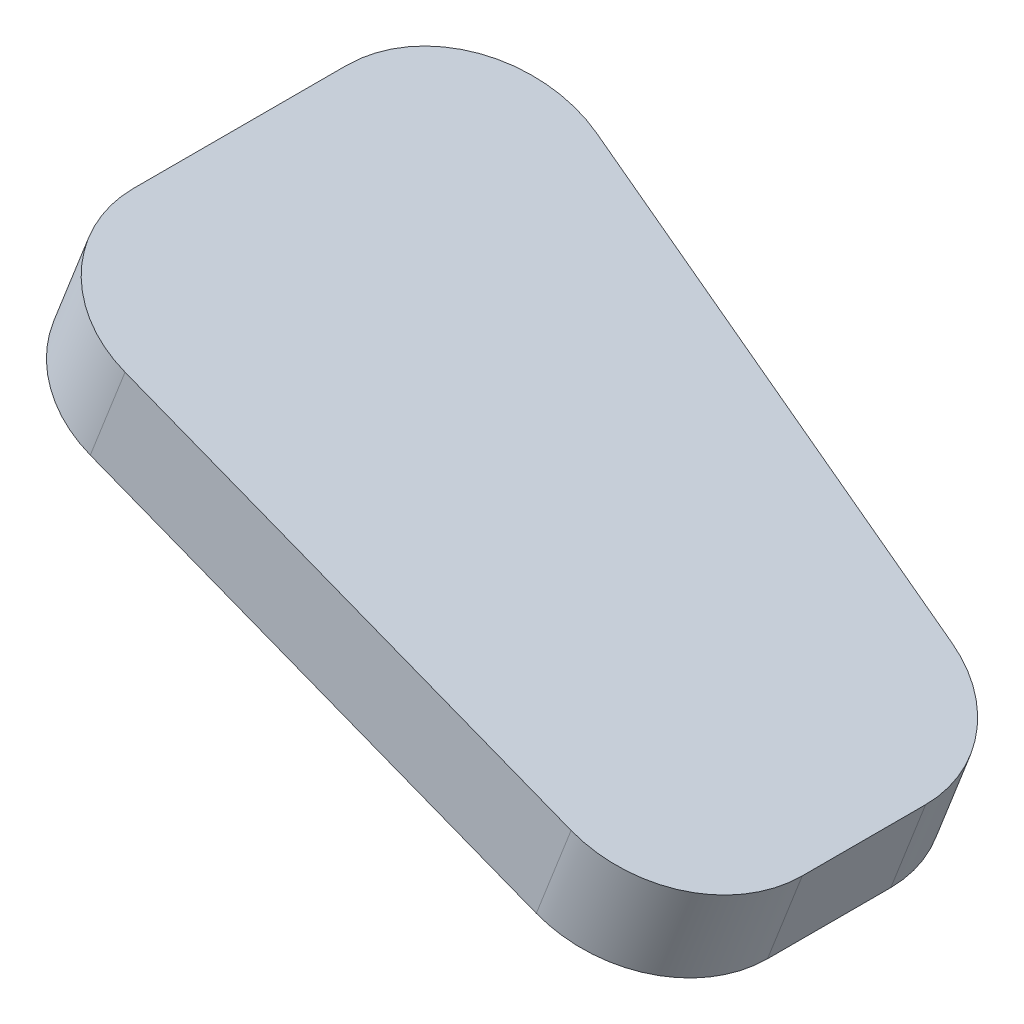
ISO-10303-21;
HEADER;
FILE_DESCRIPTION(('STEP AP214'),'2;1');
FILE_NAME('part.step','',(''),(''),'','','');
FILE_SCHEMA(('AUTOMOTIVE_DESIGN { 1 0 10303 214 1 1 1 1 }'));
ENDSEC;
DATA;
#1=APPLICATION_CONTEXT('core data for automotive mechanical design processes');
#2=APPLICATION_PROTOCOL_DEFINITION('international standard','automotive_design',2000,#1);
#3=PRODUCT_CONTEXT('',#1,'mechanical');
#4=PRODUCT('Part','Part','',(#3));
#5=PRODUCT_RELATED_PRODUCT_CATEGORY('part','',(#4));
#6=PRODUCT_DEFINITION_FORMATION('','',#4);
#7=PRODUCT_DEFINITION_CONTEXT('part definition',#1,'design');
#8=PRODUCT_DEFINITION('design','',#6,#7);
#9=PRODUCT_DEFINITION_SHAPE('','',#8);
#10=(LENGTH_UNIT() NAMED_UNIT(*) SI_UNIT(.MILLI.,.METRE.));
#11=(NAMED_UNIT(*) PLANE_ANGLE_UNIT() SI_UNIT($,.RADIAN.));
#12=(NAMED_UNIT(*) SI_UNIT($,.STERADIAN.) SOLID_ANGLE_UNIT());
#13=UNCERTAINTY_MEASURE_WITH_UNIT(LENGTH_MEASURE(1.E-05),#10,'distance_accuracy_value','');
#14=(GEOMETRIC_REPRESENTATION_CONTEXT(3) GLOBAL_UNCERTAINTY_ASSIGNED_CONTEXT((#13)) GLOBAL_UNIT_ASSIGNED_CONTEXT((#10,
#11,#12)) REPRESENTATION_CONTEXT('',''));
#15=CARTESIAN_POINT('',(0.,0.,0.));
#16=DIRECTION('',(0.,0.,1.));
#17=DIRECTION('',(1.,0.,0.));
#18=AXIS2_PLACEMENT_3D('',#15,#16,#17);
#19=CARTESIAN_POINT('',(-40.7567660289849,4.12479588738942,25.2408424106368));
#20=DIRECTION('',(-0.363059071754713,-0.931766124312644,0.));
#21=DIRECTION('',(0.931766124312644,-0.363059071754713,0.));
#22=AXIS2_PLACEMENT_3D('',#19,#20,#21);
#23=CYLINDRICAL_SURFACE('',#22,3.175);
#24=CARTESIAN_POINT('',(-41.6789360712419,1.75810993163531,25.2408424106368));
#25=DIRECTION('',(0.363059071754713,0.931766124312644,0.));
#26=DIRECTION('',(-0.931766124312644,0.363059071754713,0.));
#27=AXIS2_PLACEMENT_3D('',#24,#25,#26);
#28=CIRCLE('',#27,3.175);
#29=CARTESIAN_POINT('',(-44.6372935159345,2.91082248445652,25.2408424106368));
#30=VERTEX_POINT('',#29);
#31=CARTESIAN_POINT('',(-41.6789360712419,1.75810993163531,28.4158424106368));
#32=VERTEX_POINT('',#31);
#33=EDGE_CURVE('E128',#30,#32,#28,.T.);
#34=ORIENTED_EDGE('',*,*,#33,.T.);
#35=DIRECTION('',(-0.363059071754713,-0.931766124312644,0.));
#36=VECTOR('',#35,1.);
#37=CARTESIAN_POINT('',(-40.7567660289849,4.12479588738942,28.4158424106368));
#38=LINE('',#37,#36);
#39=CARTESIAN_POINT('',(-40.7567660289849,4.12479588738942,28.4158424106368));
#40=VERTEX_POINT('',#39);
#41=EDGE_CURVE('E11',#40,#32,#38,.T.);
#42=ORIENTED_EDGE('',*,*,#41,.F.);
#43=CARTESIAN_POINT('',(-40.7567660289849,4.12479588738942,25.2408424106368));
#44=DIRECTION('',(0.363059071754713,0.931766124312644,0.));
#45=DIRECTION('',(-0.931766124312644,0.363059071754713,0.));
#46=AXIS2_PLACEMENT_3D('',#43,#44,#45);
#47=CIRCLE('',#46,3.175);
#48=CARTESIAN_POINT('',(-43.7151234736775,5.27750844021064,25.2408424106368));
#49=VERTEX_POINT('',#48);
#50=EDGE_CURVE('E142',#49,#40,#47,.T.);
#51=ORIENTED_EDGE('',*,*,#50,.F.);
#52=DIRECTION('',(-0.363059071754713,-0.931766124312644,0.));
#53=VECTOR('',#52,1.);
#54=CARTESIAN_POINT('',(-43.7151234736775,5.27750844021064,25.2408424106368));
#55=LINE('',#54,#53);
#56=EDGE_CURVE('E124',#49,#30,#55,.T.);
#57=ORIENTED_EDGE('',*,*,#56,.T.);
#58=EDGE_LOOP('',(#34,#42,#51,#57));
#59=FACE_BOUND('',#58,.T.);
#60=ADVANCED_FACE('F32',(#59),#23,.T.);
#61=CARTESIAN_POINT('',(-40.7567660289849,4.12479588738942,28.4158424106368));
#62=DIRECTION('',(0.,0.,-1.));
#63=DIRECTION('',(-1.,0.,0.));
#64=AXIS2_PLACEMENT_3D('',#61,#62,#63);
#65=PLANE('',#64);
#66=DIRECTION('',(0.931766124312644,-0.363059071754713,0.));
#67=VECTOR('',#66,1.);
#68=CARTESIAN_POINT('',(-41.6789360712419,1.75810993163531,28.4158424106368));
#69=LINE('',#68,#67);
#70=CARTESIAN_POINT('',(-29.8455062924713,-2.85274027964955,28.4158424106368));
#71=VERTEX_POINT('',#70);
#72=EDGE_CURVE('E131',#32,#71,#69,.T.);
#73=ORIENTED_EDGE('',*,*,#72,.T.);
#74=DIRECTION('',(-0.363059071754713,-0.931766124312644,0.));
#75=VECTOR('',#74,1.);
#76=CARTESIAN_POINT('',(-28.9233362502143,-0.486054323895435,28.4158424106368));
#77=LINE('',#76,#75);
#78=CARTESIAN_POINT('',(-28.9233362502143,-0.486054323895435,28.4158424106368));
#79=VERTEX_POINT('',#78);
#80=EDGE_CURVE('E40',#79,#71,#77,.T.);
#81=ORIENTED_EDGE('',*,*,#80,.F.);
#82=DIRECTION('',(0.931766124312644,-0.363059071754713,0.));
#83=VECTOR('',#82,1.);
#84=CARTESIAN_POINT('',(-40.7567660289849,4.12479588738942,28.4158424106368));
#85=LINE('',#84,#83);
#86=EDGE_CURVE('E91',#40,#79,#85,.T.);
#87=ORIENTED_EDGE('',*,*,#86,.F.);
#88=ORIENTED_EDGE('',*,*,#41,.T.);
#89=EDGE_LOOP('',(#73,#81,#87,#88));
#90=FACE_BOUND('',#89,.T.);
#91=ADVANCED_FACE('F177',(#90),#65,.F.);
#92=CARTESIAN_POINT('',(-28.9233362502143,-0.48605432389542,25.2408424106368));
#93=DIRECTION('',(-0.363059071754713,-0.931766124312644,0.));
#94=DIRECTION('',(0.931766124312644,-0.363059071754713,0.));
#95=AXIS2_PLACEMENT_3D('',#92,#93,#94);
#96=CYLINDRICAL_SURFACE('',#95,3.175);
#97=CARTESIAN_POINT('',(-29.8455062924713,-2.85274027964954,25.2408424106368));
#98=DIRECTION('',(0.363059071754713,0.931766124312644,0.));
#99=DIRECTION('',(-0.931766124312644,0.363059071754713,0.));
#100=AXIS2_PLACEMENT_3D('',#97,#98,#99);
#101=CIRCLE('',#100,3.175);
#102=CARTESIAN_POINT('',(-26.8871488477787,-4.00545283247075,25.2408424106368));
#103=VERTEX_POINT('',#102);
#104=EDGE_CURVE('E133',#71,#103,#101,.T.);
#105=ORIENTED_EDGE('',*,*,#104,.T.);
#106=DIRECTION('',(-0.363059071754713,-0.931766124312644,0.));
#107=VECTOR('',#106,1.);
#108=CARTESIAN_POINT('',(-25.9649788055217,-1.63876687671663,25.2408424106368));
#109=LINE('',#108,#107);
#110=CARTESIAN_POINT('',(-25.9649788055217,-1.63876687671663,25.2408424106368));
#111=VERTEX_POINT('',#110);
#112=EDGE_CURVE('E149',#111,#103,#109,.T.);
#113=ORIENTED_EDGE('',*,*,#112,.F.);
#114=CARTESIAN_POINT('',(-28.9233362502143,-0.48605432389542,25.2408424106368));
#115=DIRECTION('',(0.363059071754713,0.931766124312644,0.));
#116=DIRECTION('',(-0.931766124312644,0.363059071754713,0.));
#117=AXIS2_PLACEMENT_3D('',#114,#115,#116);
#118=CIRCLE('',#117,3.175);
#119=EDGE_CURVE('E157',#79,#111,#118,.T.);
#120=ORIENTED_EDGE('',*,*,#119,.F.);
#121=ORIENTED_EDGE('',*,*,#80,.T.);
#122=EDGE_LOOP('',(#105,#113,#120,#121));
#123=FACE_BOUND('',#122,.T.);
#124=ADVANCED_FACE('F155',(#123),#96,.T.);
#125=CARTESIAN_POINT('',(-25.9649788055217,-1.63876687671663,25.2408424106368));
#126=DIRECTION('',(-0.931766124312644,0.363059071754713,0.));
#127=DIRECTION('',(-0.363059071754713,-0.931766124312644,0.));
#128=AXIS2_PLACEMENT_3D('',#125,#126,#127);
#129=PLANE('',#128);
#130=DIRECTION('',(0.,0.,-1.));
#131=VECTOR('',#130,1.);
#132=CARTESIAN_POINT('',(-26.8871488477787,-4.00545283247075,25.2408424106368));
#133=LINE('',#132,#131);
#134=CARTESIAN_POINT('',(-26.8871488477786,-4.00545283247076,21.9691047499001));
#135=VERTEX_POINT('',#134);
#136=EDGE_CURVE('E135',#103,#135,#133,.T.);
#137=ORIENTED_EDGE('',*,*,#136,.T.);
#138=DIRECTION('',(-0.363059071754713,-0.931766124312644,0.));
#139=VECTOR('',#138,1.);
#140=CARTESIAN_POINT('',(-25.9649788055217,-1.63876687671664,21.9691047499001));
#141=LINE('',#140,#139);
#142=CARTESIAN_POINT('',(-25.9649788055217,-1.63876687671664,21.9691047499001));
#143=VERTEX_POINT('',#142);
#144=EDGE_CURVE('E146',#143,#135,#141,.T.);
#145=ORIENTED_EDGE('',*,*,#144,.F.);
#146=DIRECTION('',(0.,0.,-1.));
#147=VECTOR('',#146,1.);
#148=CARTESIAN_POINT('',(-25.9649788055217,-1.63876687671663,25.2408424106368));
#149=LINE('',#148,#147);
#150=EDGE_CURVE('E169',#111,#143,#149,.T.);
#151=ORIENTED_EDGE('',*,*,#150,.F.);
#152=ORIENTED_EDGE('',*,*,#112,.T.);
#153=EDGE_LOOP('',(#137,#145,#151,#152));
#154=FACE_BOUND('',#153,.T.);
#155=ADVANCED_FACE('F165',(#154),#129,.F.);
#156=CARTESIAN_POINT('',(-28.9233362502143,-0.48605432389542,21.9691047499001));
#157=DIRECTION('',(-0.363059071754713,-0.931766124312644,0.));
#158=DIRECTION('',(0.931766124312644,-0.363059071754713,0.));
#159=AXIS2_PLACEMENT_3D('',#156,#157,#158);
#160=CYLINDRICAL_SURFACE('',#159,3.17500000000002);
#161=CARTESIAN_POINT('',(-29.8455062924713,-2.85274027964954,21.9691047499001));
#162=DIRECTION('',(0.363059071754713,0.931766124312644,0.));
#163=DIRECTION('',(-0.931766124312644,0.363059071754713,0.));
#164=AXIS2_PLACEMENT_3D('',#161,#162,#163);
#165=CIRCLE('',#164,3.17500000000002);
#166=CARTESIAN_POINT('',(-29.2972043405591,-3.06638401760943,18.8491133520338));
#167=VERTEX_POINT('',#166);
#168=EDGE_CURVE('E137',#135,#167,#165,.T.);
#169=ORIENTED_EDGE('',*,*,#168,.T.);
#170=DIRECTION('',(-0.363059071754713,-0.931766124312644,0.));
#171=VECTOR('',#170,1.);
#172=CARTESIAN_POINT('',(-28.3750342983021,-0.699698061855312,18.8491133520338));
#173=LINE('',#172,#171);
#174=CARTESIAN_POINT('',(-28.3750342983021,-0.699698061855312,18.8491133520338));
#175=VERTEX_POINT('',#174);
#176=EDGE_CURVE('E119',#175,#167,#173,.T.);
#177=ORIENTED_EDGE('',*,*,#176,.F.);
#178=CARTESIAN_POINT('',(-28.9233362502143,-0.48605432389542,21.9691047499001));
#179=DIRECTION('',(0.363059071754713,0.931766124312644,0.));
#180=DIRECTION('',(-0.931766124312644,0.363059071754713,0.));
#181=AXIS2_PLACEMENT_3D('',#178,#179,#180);
#182=CIRCLE('',#181,3.17500000000002);
#183=EDGE_CURVE('E110',#143,#175,#182,.T.);
#184=ORIENTED_EDGE('',*,*,#183,.F.);
#185=ORIENTED_EDGE('',*,*,#144,.T.);
#186=EDGE_LOOP('',(#169,#177,#184,#185));
#187=FACE_BOUND('',#186,.T.);
#188=ADVANCED_FACE('F168',(#187),#160,.T.);
#189=CARTESIAN_POINT('',(-28.3750342983021,-0.699698061855312,18.8491133520338));
#190=DIRECTION('',(-0.172693528161326,0.0672893662865765,0.982674456020886));
#191=DIRECTION('',(0.984906745104171,0.,0.173085826826775));
#192=AXIS2_PLACEMENT_3D('',#189,#190,#191);
#193=PLANE('',#192);
#194=DIRECTION('',(-0.915622769347617,0.356768875840011,-0.185339994291722));
#195=VECTOR('',#194,1.);
#196=CARTESIAN_POINT('',(-29.2972043405591,-3.06638401760943,18.8491133520338));
#197=LINE('',#196,#195);
#198=CARTESIAN_POINT('',(-41.1306341193296,1.54446619367542,16.4537952351509));
#199=VERTEX_POINT('',#198);
#200=EDGE_CURVE('E118',#167,#199,#197,.T.);
#201=ORIENTED_EDGE('',*,*,#200,.T.);
#202=DIRECTION('',(-0.363059071754713,-0.931766124312644,0.));
#203=VECTOR('',#202,1.);
#204=CARTESIAN_POINT('',(-40.2084640770727,3.91115214942954,16.4537952351509));
#205=LINE('',#204,#203);
#206=CARTESIAN_POINT('',(-40.2084640770727,3.91115214942954,16.4537952351509));
#207=VERTEX_POINT('',#206);
#208=EDGE_CURVE('E115',#207,#199,#205,.T.);
#209=ORIENTED_EDGE('',*,*,#208,.F.);
#210=DIRECTION('',(-0.915622769347617,0.356768875840011,-0.185339994291722));
#211=VECTOR('',#210,1.);
#212=CARTESIAN_POINT('',(-28.3750342983021,-0.699698061855312,18.8491133520338));
#213=LINE('',#212,#211);
#214=EDGE_CURVE('E104',#175,#207,#213,.T.);
#215=ORIENTED_EDGE('',*,*,#214,.F.);
#216=ORIENTED_EDGE('',*,*,#176,.T.);
#217=EDGE_LOOP('',(#201,#209,#215,#216));
#218=FACE_BOUND('',#217,.T.);
#219=ADVANCED_FACE('F116',(#218),#193,.F.);
#220=CARTESIAN_POINT('',(-40.7567660289849,4.12479588738942,19.5737866330172));
#221=DIRECTION('',(-0.363059071754713,-0.931766124312644,0.));
#222=DIRECTION('',(0.931766124312644,-0.363059071754713,0.));
#223=AXIS2_PLACEMENT_3D('',#220,#221,#222);
#224=CYLINDRICAL_SURFACE('',#223,3.175);
#225=CARTESIAN_POINT('',(-41.6789360712419,1.75810993163531,19.5737866330172));
#226=DIRECTION('',(0.363059071754713,0.931766124312644,0.));
#227=DIRECTION('',(-0.931766124312644,0.363059071754713,0.));
#228=AXIS2_PLACEMENT_3D('',#225,#226,#227);
#229=CIRCLE('',#228,3.175);
#230=CARTESIAN_POINT('',(-44.6372935159345,2.91082248445652,19.5737866330172));
#231=VERTEX_POINT('',#230);
#232=EDGE_CURVE('E77',#199,#231,#229,.T.);
#233=ORIENTED_EDGE('',*,*,#232,.T.);
#234=DIRECTION('',(-0.363059071754713,-0.931766124312644,0.));
#235=VECTOR('',#234,1.);
#236=CARTESIAN_POINT('',(-43.7151234736775,5.27750844021064,19.5737866330172));
#237=LINE('',#236,#235);
#238=CARTESIAN_POINT('',(-43.7151234736775,5.27750844021064,19.5737866330172));
#239=VERTEX_POINT('',#238);
#240=EDGE_CURVE('E120',#239,#231,#237,.T.);
#241=ORIENTED_EDGE('',*,*,#240,.F.);
#242=CARTESIAN_POINT('',(-40.7567660289849,4.12479588738942,19.5737866330172));
#243=DIRECTION('',(0.363059071754713,0.931766124312644,0.));
#244=DIRECTION('',(-0.931766124312644,0.363059071754713,0.));
#245=AXIS2_PLACEMENT_3D('',#242,#243,#244);
#246=CIRCLE('',#245,3.175);
#247=EDGE_CURVE('E108',#207,#239,#246,.T.);
#248=ORIENTED_EDGE('',*,*,#247,.F.);
#249=ORIENTED_EDGE('',*,*,#208,.T.);
#250=EDGE_LOOP('',(#233,#241,#248,#249));
#251=FACE_BOUND('',#250,.T.);
#252=ADVANCED_FACE('F122',(#251),#224,.T.);
#253=CARTESIAN_POINT('',(-43.7151234736775,5.27750844021064,19.5737866330172));
#254=DIRECTION('',(0.931766124312644,-0.363059071754713,0.));
#255=DIRECTION('',(0.363059071754713,0.931766124312644,0.));
#256=AXIS2_PLACEMENT_3D('',#253,#254,#255);
#257=PLANE('',#256);
#258=DIRECTION('',(0.,0.,1.));
#259=VECTOR('',#258,1.);
#260=CARTESIAN_POINT('',(-44.6372935159345,2.91082248445652,19.5737866330172));
#261=LINE('',#260,#259);
#262=EDGE_CURVE('E83',#231,#30,#261,.T.);
#263=ORIENTED_EDGE('',*,*,#262,.T.);
#264=ORIENTED_EDGE('',*,*,#56,.F.);
#265=DIRECTION('',(0.,0.,1.));
#266=VECTOR('',#265,1.);
#267=CARTESIAN_POINT('',(-43.7151234736775,5.27750844021064,19.5737866330172));
#268=LINE('',#267,#266);
#269=EDGE_CURVE('E48',#239,#49,#268,.T.);
#270=ORIENTED_EDGE('',*,*,#269,.F.);
#271=ORIENTED_EDGE('',*,*,#240,.T.);
#272=EDGE_LOOP('',(#263,#264,#270,#271));
#273=FACE_BOUND('',#272,.T.);
#274=ADVANCED_FACE('F193',(#273),#257,.F.);
#275=CARTESIAN_POINT('',(-40.7567660289849,4.12479588738942,25.2408424106368));
#276=DIRECTION('',(0.363059071754713,0.931766124312644,0.));
#277=DIRECTION('',(-0.931766124312644,0.363059071754713,0.));
#278=AXIS2_PLACEMENT_3D('',#275,#276,#277);
#279=PLANE('',#278);
#280=ORIENTED_EDGE('',*,*,#50,.T.);
#281=ORIENTED_EDGE('',*,*,#86,.T.);
#282=ORIENTED_EDGE('',*,*,#119,.T.);
#283=ORIENTED_EDGE('',*,*,#150,.T.);
#284=ORIENTED_EDGE('',*,*,#183,.T.);
#285=ORIENTED_EDGE('',*,*,#214,.T.);
#286=ORIENTED_EDGE('',*,*,#247,.T.);
#287=ORIENTED_EDGE('',*,*,#269,.T.);
#288=EDGE_LOOP('',(#280,#281,#282,#283,#284,#285,#286,#287));
#289=FACE_BOUND('',#288,.T.);
#290=ADVANCED_FACE('F106',(#289),#279,.T.);
#291=CARTESIAN_POINT('',(-41.6789360712419,1.75810993163531,25.2408424106368));
#292=DIRECTION('',(0.363059071754713,0.931766124312644,0.));
#293=DIRECTION('',(-0.931766124312644,0.363059071754713,0.));
#294=AXIS2_PLACEMENT_3D('',#291,#292,#293);
#295=PLANE('',#294);
#296=ORIENTED_EDGE('',*,*,#33,.F.);
#297=ORIENTED_EDGE('',*,*,#262,.F.);
#298=ORIENTED_EDGE('',*,*,#232,.F.);
#299=ORIENTED_EDGE('',*,*,#200,.F.);
#300=ORIENTED_EDGE('',*,*,#168,.F.);
#301=ORIENTED_EDGE('',*,*,#136,.F.);
#302=ORIENTED_EDGE('',*,*,#104,.F.);
#303=ORIENTED_EDGE('',*,*,#72,.F.);
#304=EDGE_LOOP('',(#296,#297,#298,#299,#300,#301,#302,#303));
#305=FACE_BOUND('',#304,.T.);
#306=ADVANCED_FACE('F161',(#305),#295,.F.);
#307=CLOSED_SHELL('',(#60,#91,#124,#155,#188,#219,#252,#274,#290,#306));
#308=MANIFOLD_SOLID_BREP('B2',#307);
#309=ADVANCED_BREP_SHAPE_REPRESENTATION('',(#18,#308),#14);
#310=SHAPE_DEFINITION_REPRESENTATION(#9,#309);
ENDSEC;
END-ISO-10303-21;
